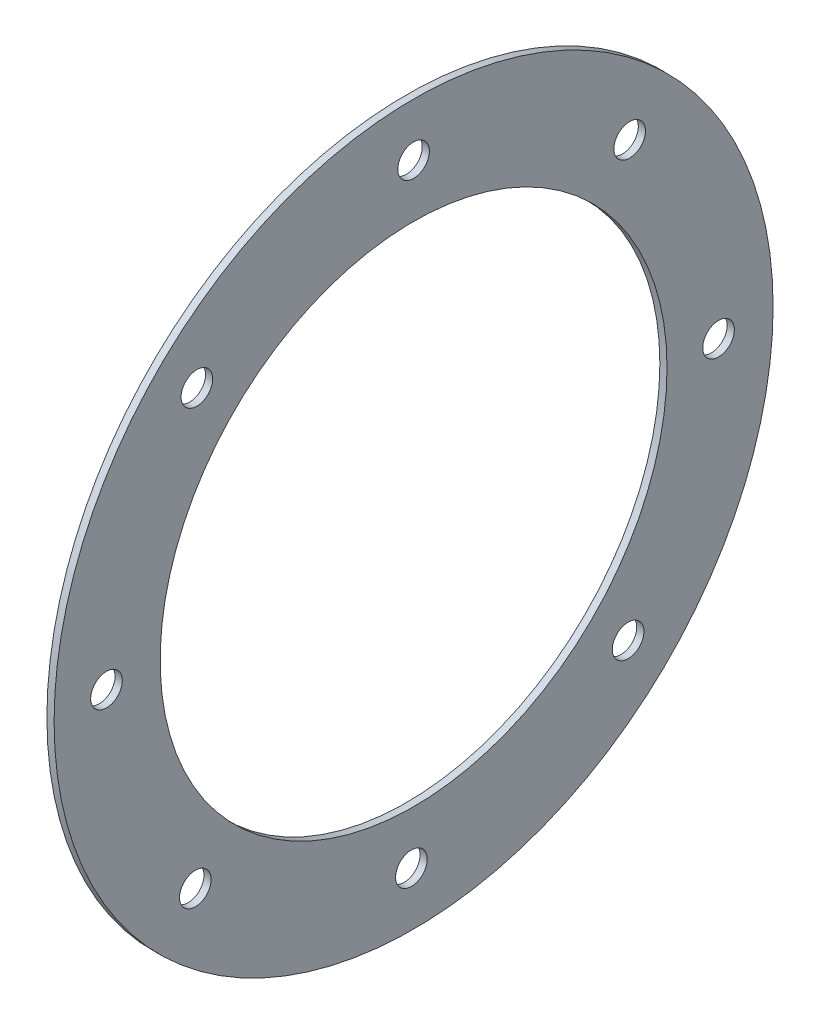
ISO-10303-21;
HEADER;
FILE_DESCRIPTION(('STEP AP214'),'2;1');
FILE_NAME('part.step','',(''),(''),'','','');
FILE_SCHEMA(('AUTOMOTIVE_DESIGN { 1 0 10303 214 1 1 1 1 }'));
ENDSEC;
DATA;
#1=APPLICATION_CONTEXT('core data for automotive mechanical design processes');
#2=APPLICATION_PROTOCOL_DEFINITION('international standard','automotive_design',2000,#1);
#3=PRODUCT_CONTEXT('',#1,'mechanical');
#4=PRODUCT('Part','Part','',(#3));
#5=PRODUCT_RELATED_PRODUCT_CATEGORY('part','',(#4));
#6=PRODUCT_DEFINITION_FORMATION('','',#4);
#7=PRODUCT_DEFINITION_CONTEXT('part definition',#1,'design');
#8=PRODUCT_DEFINITION('design','',#6,#7);
#9=PRODUCT_DEFINITION_SHAPE('','',#8);
#10=(LENGTH_UNIT() NAMED_UNIT(*) SI_UNIT(.MILLI.,.METRE.));
#11=(NAMED_UNIT(*) PLANE_ANGLE_UNIT() SI_UNIT($,.RADIAN.));
#12=(NAMED_UNIT(*) SI_UNIT($,.STERADIAN.) SOLID_ANGLE_UNIT());
#13=UNCERTAINTY_MEASURE_WITH_UNIT(LENGTH_MEASURE(1.E-05),#10,'distance_accuracy_value','');
#14=(GEOMETRIC_REPRESENTATION_CONTEXT(3) GLOBAL_UNCERTAINTY_ASSIGNED_CONTEXT((#13)) GLOBAL_UNIT_ASSIGNED_CONTEXT((#10,
#11,#12)) REPRESENTATION_CONTEXT('',''));
#15=CARTESIAN_POINT('',(0.,0.,0.));
#16=DIRECTION('',(0.,0.,1.));
#17=DIRECTION('',(1.,0.,0.));
#18=AXIS2_PLACEMENT_3D('',#15,#16,#17);
#19=CARTESIAN_POINT('',(2.,0.,0.));
#20=DIRECTION('',(1.,0.,0.));
#21=DIRECTION('',(0.,0.,-1.));
#22=AXIS2_PLACEMENT_3D('',#19,#20,#21);
#23=PLANE('',#22);
#24=CARTESIAN_POINT('',(2.,0.42677669526568,85.4267766952657));
#25=DIRECTION('',(1.,0.,0.));
#26=DIRECTION('',(0.,0.,-1.));
#27=AXIS2_PLACEMENT_3D('',#24,#25,#26);
#28=CIRCLE('',#27,4.4);
#29=CARTESIAN_POINT('',(2.,0.42677669526568,81.0267766952657));
#30=VERTEX_POINT('',#29);
#31=EDGE_CURVE('E93',#30,#30,#28,.T.);
#32=ORIENTED_EDGE('',*,*,#31,.F.);
#33=EDGE_LOOP('',(#32));
#34=FACE_BOUND('',#33,.T.);
#35=CARTESIAN_POINT('',(2.,-85.,0.603553390531353));
#36=DIRECTION('',(1.,0.,0.));
#37=DIRECTION('',(0.,0.,-1.));
#38=AXIS2_PLACEMENT_3D('',#35,#36,#37);
#39=CIRCLE('',#38,4.4);
#40=CARTESIAN_POINT('',(2.,-85.,-3.79644660946865));
#41=VERTEX_POINT('',#40);
#42=EDGE_CURVE('E78',#41,#41,#39,.T.);
#43=ORIENTED_EDGE('',*,*,#42,.F.);
#44=EDGE_LOOP('',(#43));
#45=FACE_BOUND('',#44,.T.);
#46=CARTESIAN_POINT('',(2.,-0.176776695265662,-84.8232233047343));
#47=DIRECTION('',(1.,0.,0.));
#48=DIRECTION('',(0.,0.,-1.));
#49=AXIS2_PLACEMENT_3D('',#46,#47,#48);
#50=CIRCLE('',#49,4.4);
#51=CARTESIAN_POINT('',(2.,-0.176776695265662,-89.2232233047343));
#52=VERTEX_POINT('',#51);
#53=EDGE_CURVE('E70',#52,#52,#50,.T.);
#54=ORIENTED_EDGE('',*,*,#53,.F.);
#55=EDGE_LOOP('',(#54));
#56=FACE_BOUND('',#55,.T.);
#57=CARTESIAN_POINT('',(2.,85.25,0.));
#58=DIRECTION('',(1.,0.,0.));
#59=DIRECTION('',(0.,0.,-1.));
#60=AXIS2_PLACEMENT_3D('',#57,#58,#59);
#61=CIRCLE('',#60,4.4);
#62=CARTESIAN_POINT('',(2.,85.25,-4.4));
#63=VERTEX_POINT('',#62);
#64=EDGE_CURVE('E54',#63,#63,#61,.T.);
#65=ORIENTED_EDGE('',*,*,#64,.F.);
#66=EDGE_LOOP('',(#65));
#67=FACE_BOUND('',#66,.T.);
#68=CARTESIAN_POINT('',(2.,0.,0.));
#69=DIRECTION('',(1.,0.,0.));
#70=DIRECTION('',(0.,0.,-1.));
#71=AXIS2_PLACEMENT_3D('',#68,#69,#70);
#72=CIRCLE('',#71,100.);
#73=CARTESIAN_POINT('',(2.,0.,-100.));
#74=VERTEX_POINT('',#73);
#75=EDGE_CURVE('E10',#74,#74,#72,.T.);
#76=ORIENTED_EDGE('',*,*,#75,.T.);
#77=EDGE_LOOP('',(#76));
#78=FACE_BOUND('',#77,.T.);
#79=CARTESIAN_POINT('',(2.,0.,0.));
#80=DIRECTION('',(1.,0.,0.));
#81=DIRECTION('',(0.,0.,-1.));
#82=AXIS2_PLACEMENT_3D('',#79,#80,#81);
#83=CIRCLE('',#82,70.5);
#84=CARTESIAN_POINT('',(2.,0.,-70.5));
#85=VERTEX_POINT('',#84);
#86=EDGE_CURVE('E49',#85,#85,#83,.T.);
#87=ORIENTED_EDGE('',*,*,#86,.F.);
#88=EDGE_LOOP('',(#87));
#89=FACE_BOUND('',#88,.T.);
#90=CARTESIAN_POINT('',(2.,60.1040764008784,-60.1040764008656));
#91=DIRECTION('',(1.,0.,0.));
#92=DIRECTION('',(0.,0.,-1.));
#93=AXIS2_PLACEMENT_3D('',#90,#91,#92);
#94=CIRCLE('',#93,4.39999999999999);
#95=CARTESIAN_POINT('',(2.,60.1040764008784,-64.5040764008656));
#96=VERTEX_POINT('',#95);
#97=EDGE_CURVE('E61',#96,#96,#94,.T.);
#98=ORIENTED_EDGE('',*,*,#97,.F.);
#99=EDGE_LOOP('',(#98));
#100=FACE_BOUND('',#99,.T.);
#101=CARTESIAN_POINT('',(2.,-60.2808530961313,-59.6772997056127));
#102=DIRECTION('',(1.,0.,0.));
#103=DIRECTION('',(0.,0.,-1.));
#104=AXIS2_PLACEMENT_3D('',#101,#102,#103);
#105=CIRCLE('',#104,4.4);
#106=CARTESIAN_POINT('',(2.,-60.2808530961313,-64.0772997056127));
#107=VERTEX_POINT('',#106);
#108=EDGE_CURVE('E71',#107,#107,#105,.T.);
#109=ORIENTED_EDGE('',*,*,#108,.F.);
#110=EDGE_LOOP('',(#109));
#111=FACE_BOUND('',#110,.T.);
#112=CARTESIAN_POINT('',(2.,-59.8540764008784,60.707629791397));
#113=DIRECTION('',(1.,0.,0.));
#114=DIRECTION('',(0.,0.,-1.));
#115=AXIS2_PLACEMENT_3D('',#112,#113,#114);
#116=CIRCLE('',#115,4.4);
#117=CARTESIAN_POINT('',(2.,-59.8540764008784,56.307629791397));
#118=VERTEX_POINT('',#117);
#119=EDGE_CURVE('E84',#118,#118,#116,.T.);
#120=ORIENTED_EDGE('',*,*,#119,.F.);
#121=EDGE_LOOP('',(#120));
#122=FACE_BOUND('',#121,.T.);
#123=CARTESIAN_POINT('',(2.,60.5308530961313,60.2808530961441));
#124=DIRECTION('',(1.,0.,0.));
#125=DIRECTION('',(0.,0.,-1.));
#126=AXIS2_PLACEMENT_3D('',#123,#124,#125);
#127=CIRCLE('',#126,4.4);
#128=CARTESIAN_POINT('',(2.,60.5308530961313,55.8808530961441));
#129=VERTEX_POINT('',#128);
#130=EDGE_CURVE('E100',#129,#129,#127,.T.);
#131=ORIENTED_EDGE('',*,*,#130,.F.);
#132=EDGE_LOOP('',(#131));
#133=FACE_BOUND('',#132,.T.);
#134=ADVANCED_FACE('F39',(#34,#45,#56,#67,#78,#89,#100,#111,#122,#133),#23,.T.);
#135=CARTESIAN_POINT('',(0.,0.,0.));
#136=DIRECTION('',(1.,0.,0.));
#137=DIRECTION('',(0.,0.,-1.));
#138=AXIS2_PLACEMENT_3D('',#135,#136,#137);
#139=PLANE('',#138);
#140=CARTESIAN_POINT('',(0.,0.,0.));
#141=DIRECTION('',(1.,0.,0.));
#142=DIRECTION('',(0.,0.,-1.));
#143=AXIS2_PLACEMENT_3D('',#140,#141,#142);
#144=CIRCLE('',#143,100.);
#145=CARTESIAN_POINT('',(0.,0.,-100.));
#146=VERTEX_POINT('',#145);
#147=EDGE_CURVE('E43',#146,#146,#144,.T.);
#148=ORIENTED_EDGE('',*,*,#147,.F.);
#149=EDGE_LOOP('',(#148));
#150=FACE_BOUND('',#149,.T.);
#151=CARTESIAN_POINT('',(0.,0.,0.));
#152=DIRECTION('',(1.,0.,0.));
#153=DIRECTION('',(0.,0.,-1.));
#154=AXIS2_PLACEMENT_3D('',#151,#152,#153);
#155=CIRCLE('',#154,70.5);
#156=CARTESIAN_POINT('',(0.,0.,-70.5));
#157=VERTEX_POINT('',#156);
#158=EDGE_CURVE('E55',#157,#157,#155,.T.);
#159=ORIENTED_EDGE('',*,*,#158,.T.);
#160=EDGE_LOOP('',(#159));
#161=FACE_BOUND('',#160,.T.);
#162=CARTESIAN_POINT('',(0.,85.25,0.));
#163=DIRECTION('',(1.,0.,0.));
#164=DIRECTION('',(0.,0.,-1.));
#165=AXIS2_PLACEMENT_3D('',#162,#163,#164);
#166=CIRCLE('',#165,4.4);
#167=CARTESIAN_POINT('',(0.,85.25,-4.4));
#168=VERTEX_POINT('',#167);
#169=EDGE_CURVE('E59',#168,#168,#166,.T.);
#170=ORIENTED_EDGE('',*,*,#169,.T.);
#171=EDGE_LOOP('',(#170));
#172=FACE_BOUND('',#171,.T.);
#173=CARTESIAN_POINT('',(0.,60.1040764008784,-60.1040764008656));
#174=DIRECTION('',(1.,0.,0.));
#175=DIRECTION('',(0.,0.,-1.));
#176=AXIS2_PLACEMENT_3D('',#173,#174,#175);
#177=CIRCLE('',#176,4.39999999999999);
#178=CARTESIAN_POINT('',(0.,60.1040764008784,-64.5040764008656));
#179=VERTEX_POINT('',#178);
#180=EDGE_CURVE('E63',#179,#179,#177,.T.);
#181=ORIENTED_EDGE('',*,*,#180,.T.);
#182=EDGE_LOOP('',(#181));
#183=FACE_BOUND('',#182,.T.);
#184=CARTESIAN_POINT('',(0.,-0.176776695265662,-84.8232233047343));
#185=DIRECTION('',(1.,0.,0.));
#186=DIRECTION('',(0.,0.,-1.));
#187=AXIS2_PLACEMENT_3D('',#184,#185,#186);
#188=CIRCLE('',#187,4.4);
#189=CARTESIAN_POINT('',(0.,-0.176776695265662,-89.2232233047343));
#190=VERTEX_POINT('',#189);
#191=EDGE_CURVE('E69',#190,#190,#188,.T.);
#192=ORIENTED_EDGE('',*,*,#191,.T.);
#193=EDGE_LOOP('',(#192));
#194=FACE_BOUND('',#193,.T.);
#195=CARTESIAN_POINT('',(0.,-60.2808530961313,-59.6772997056127));
#196=DIRECTION('',(1.,0.,0.));
#197=DIRECTION('',(0.,0.,-1.));
#198=AXIS2_PLACEMENT_3D('',#195,#196,#197);
#199=CIRCLE('',#198,4.4);
#200=CARTESIAN_POINT('',(0.,-60.2808530961313,-64.0772997056127));
#201=VERTEX_POINT('',#200);
#202=EDGE_CURVE('E76',#201,#201,#199,.T.);
#203=ORIENTED_EDGE('',*,*,#202,.T.);
#204=EDGE_LOOP('',(#203));
#205=FACE_BOUND('',#204,.T.);
#206=CARTESIAN_POINT('',(0.,-85.,0.603553390531353));
#207=DIRECTION('',(1.,0.,0.));
#208=DIRECTION('',(0.,0.,-1.));
#209=AXIS2_PLACEMENT_3D('',#206,#207,#208);
#210=CIRCLE('',#209,4.4);
#211=CARTESIAN_POINT('',(0.,-85.,-3.79644660946865));
#212=VERTEX_POINT('',#211);
#213=EDGE_CURVE('E85',#212,#212,#210,.T.);
#214=ORIENTED_EDGE('',*,*,#213,.T.);
#215=EDGE_LOOP('',(#214));
#216=FACE_BOUND('',#215,.T.);
#217=CARTESIAN_POINT('',(0.,-59.8540764008784,60.707629791397));
#218=DIRECTION('',(1.,0.,0.));
#219=DIRECTION('',(0.,0.,-1.));
#220=AXIS2_PLACEMENT_3D('',#217,#218,#219);
#221=CIRCLE('',#220,4.4);
#222=CARTESIAN_POINT('',(0.,-59.8540764008784,56.307629791397));
#223=VERTEX_POINT('',#222);
#224=EDGE_CURVE('E86',#223,#223,#221,.T.);
#225=ORIENTED_EDGE('',*,*,#224,.T.);
#226=EDGE_LOOP('',(#225));
#227=FACE_BOUND('',#226,.T.);
#228=CARTESIAN_POINT('',(0.,0.42677669526568,85.4267766952657));
#229=DIRECTION('',(1.,0.,0.));
#230=DIRECTION('',(0.,0.,-1.));
#231=AXIS2_PLACEMENT_3D('',#228,#229,#230);
#232=CIRCLE('',#231,4.4);
#233=CARTESIAN_POINT('',(0.,0.42677669526568,81.0267766952657));
#234=VERTEX_POINT('',#233);
#235=EDGE_CURVE('E94',#234,#234,#232,.T.);
#236=ORIENTED_EDGE('',*,*,#235,.T.);
#237=EDGE_LOOP('',(#236));
#238=FACE_BOUND('',#237,.T.);
#239=CARTESIAN_POINT('',(0.,60.5308530961313,60.2808530961441));
#240=DIRECTION('',(1.,0.,0.));
#241=DIRECTION('',(0.,0.,-1.));
#242=AXIS2_PLACEMENT_3D('',#239,#240,#241);
#243=CIRCLE('',#242,4.4);
#244=CARTESIAN_POINT('',(0.,60.5308530961313,55.8808530961441));
#245=VERTEX_POINT('',#244);
#246=EDGE_CURVE('E99',#245,#245,#243,.T.);
#247=ORIENTED_EDGE('',*,*,#246,.T.);
#248=EDGE_LOOP('',(#247));
#249=FACE_BOUND('',#248,.T.);
#250=ADVANCED_FACE('F109',(#150,#161,#172,#183,#194,#205,#216,#227,#238,#249),#139,.F.);
#251=CARTESIAN_POINT('',(2.,0.,0.));
#252=DIRECTION('',(-1.,0.,0.));
#253=DIRECTION('',(0.,0.,1.));
#254=AXIS2_PLACEMENT_3D('',#251,#252,#253);
#255=CYLINDRICAL_SURFACE('',#254,100.);
#256=ORIENTED_EDGE('',*,*,#75,.F.);
#257=EDGE_LOOP('',(#256));
#258=FACE_BOUND('',#257,.T.);
#259=ORIENTED_EDGE('',*,*,#147,.T.);
#260=EDGE_LOOP('',(#259));
#261=FACE_BOUND('',#260,.T.);
#262=ADVANCED_FACE('F41',(#258,#261),#255,.T.);
#263=CARTESIAN_POINT('',(2.,0.,0.));
#264=DIRECTION('',(-1.,0.,0.));
#265=DIRECTION('',(0.,0.,1.));
#266=AXIS2_PLACEMENT_3D('',#263,#264,#265);
#267=CYLINDRICAL_SURFACE('',#266,70.5);
#268=ORIENTED_EDGE('',*,*,#86,.T.);
#269=EDGE_LOOP('',(#268));
#270=FACE_BOUND('',#269,.T.);
#271=ORIENTED_EDGE('',*,*,#158,.F.);
#272=EDGE_LOOP('',(#271));
#273=FACE_BOUND('',#272,.T.);
#274=ADVANCED_FACE('F120',(#270,#273),#267,.F.);
#275=CARTESIAN_POINT('',(2.,85.25,0.));
#276=DIRECTION('',(-1.,0.,0.));
#277=DIRECTION('',(0.,0.,1.));
#278=AXIS2_PLACEMENT_3D('',#275,#276,#277);
#279=CYLINDRICAL_SURFACE('',#278,4.4);
#280=ORIENTED_EDGE('',*,*,#64,.T.);
#281=EDGE_LOOP('',(#280));
#282=FACE_BOUND('',#281,.T.);
#283=ORIENTED_EDGE('',*,*,#169,.F.);
#284=EDGE_LOOP('',(#283));
#285=FACE_BOUND('',#284,.T.);
#286=ADVANCED_FACE('F121',(#282,#285),#279,.F.);
#287=CARTESIAN_POINT('',(2.,60.1040764008784,-60.1040764008656));
#288=DIRECTION('',(-1.,0.,0.));
#289=DIRECTION('',(0.,0.,1.));
#290=AXIS2_PLACEMENT_3D('',#287,#288,#289);
#291=CYLINDRICAL_SURFACE('',#290,4.39999999999999);
#292=ORIENTED_EDGE('',*,*,#97,.T.);
#293=EDGE_LOOP('',(#292));
#294=FACE_BOUND('',#293,.T.);
#295=ORIENTED_EDGE('',*,*,#180,.F.);
#296=EDGE_LOOP('',(#295));
#297=FACE_BOUND('',#296,.T.);
#298=ADVANCED_FACE('F130',(#294,#297),#291,.F.);
#299=CARTESIAN_POINT('',(2.,-0.176776695265662,-84.8232233047343));
#300=DIRECTION('',(-1.,0.,0.));
#301=DIRECTION('',(0.,0.,1.));
#302=AXIS2_PLACEMENT_3D('',#299,#300,#301);
#303=CYLINDRICAL_SURFACE('',#302,4.4);
#304=ORIENTED_EDGE('',*,*,#53,.T.);
#305=EDGE_LOOP('',(#304));
#306=FACE_BOUND('',#305,.T.);
#307=ORIENTED_EDGE('',*,*,#191,.F.);
#308=EDGE_LOOP('',(#307));
#309=FACE_BOUND('',#308,.T.);
#310=ADVANCED_FACE('F131',(#306,#309),#303,.F.);
#311=CARTESIAN_POINT('',(2.,-60.2808530961313,-59.6772997056127));
#312=DIRECTION('',(-1.,0.,0.));
#313=DIRECTION('',(0.,0.,1.));
#314=AXIS2_PLACEMENT_3D('',#311,#312,#313);
#315=CYLINDRICAL_SURFACE('',#314,4.4);
#316=ORIENTED_EDGE('',*,*,#108,.T.);
#317=EDGE_LOOP('',(#316));
#318=FACE_BOUND('',#317,.T.);
#319=ORIENTED_EDGE('',*,*,#202,.F.);
#320=EDGE_LOOP('',(#319));
#321=FACE_BOUND('',#320,.T.);
#322=ADVANCED_FACE('F135',(#318,#321),#315,.F.);
#323=CARTESIAN_POINT('',(2.,-85.,0.603553390531353));
#324=DIRECTION('',(-1.,0.,0.));
#325=DIRECTION('',(0.,0.,1.));
#326=AXIS2_PLACEMENT_3D('',#323,#324,#325);
#327=CYLINDRICAL_SURFACE('',#326,4.4);
#328=ORIENTED_EDGE('',*,*,#42,.T.);
#329=EDGE_LOOP('',(#328));
#330=FACE_BOUND('',#329,.T.);
#331=ORIENTED_EDGE('',*,*,#213,.F.);
#332=EDGE_LOOP('',(#331));
#333=FACE_BOUND('',#332,.T.);
#334=ADVANCED_FACE('F137',(#330,#333),#327,.F.);
#335=CARTESIAN_POINT('',(2.,-59.8540764008784,60.707629791397));
#336=DIRECTION('',(-1.,0.,0.));
#337=DIRECTION('',(0.,0.,1.));
#338=AXIS2_PLACEMENT_3D('',#335,#336,#337);
#339=CYLINDRICAL_SURFACE('',#338,4.4);
#340=ORIENTED_EDGE('',*,*,#119,.T.);
#341=EDGE_LOOP('',(#340));
#342=FACE_BOUND('',#341,.T.);
#343=ORIENTED_EDGE('',*,*,#224,.F.);
#344=EDGE_LOOP('',(#343));
#345=FACE_BOUND('',#344,.T.);
#346=ADVANCED_FACE('F141',(#342,#345),#339,.F.);
#347=CARTESIAN_POINT('',(2.,0.42677669526568,85.4267766952657));
#348=DIRECTION('',(-1.,0.,0.));
#349=DIRECTION('',(0.,0.,1.));
#350=AXIS2_PLACEMENT_3D('',#347,#348,#349);
#351=CYLINDRICAL_SURFACE('',#350,4.4);
#352=ORIENTED_EDGE('',*,*,#31,.T.);
#353=EDGE_LOOP('',(#352));
#354=FACE_BOUND('',#353,.T.);
#355=ORIENTED_EDGE('',*,*,#235,.F.);
#356=EDGE_LOOP('',(#355));
#357=FACE_BOUND('',#356,.T.);
#358=ADVANCED_FACE('F150',(#354,#357),#351,.F.);
#359=CARTESIAN_POINT('',(2.,60.5308530961313,60.2808530961441));
#360=DIRECTION('',(-1.,0.,0.));
#361=DIRECTION('',(0.,0.,1.));
#362=AXIS2_PLACEMENT_3D('',#359,#360,#361);
#363=CYLINDRICAL_SURFACE('',#362,4.4);
#364=ORIENTED_EDGE('',*,*,#130,.T.);
#365=EDGE_LOOP('',(#364));
#366=FACE_BOUND('',#365,.T.);
#367=ORIENTED_EDGE('',*,*,#246,.F.);
#368=EDGE_LOOP('',(#367));
#369=FACE_BOUND('',#368,.T.);
#370=ADVANCED_FACE('F106',(#366,#369),#363,.F.);
#371=CLOSED_SHELL('',(#134,#250,#262,#274,#286,#298,#310,#322,#334,#346,#358,#370));
#372=MANIFOLD_SOLID_BREP('B2',#371);
#373=ADVANCED_BREP_SHAPE_REPRESENTATION('',(#18,#372),#14);
#374=SHAPE_DEFINITION_REPRESENTATION(#9,#373);
ENDSEC;
END-ISO-10303-21;
